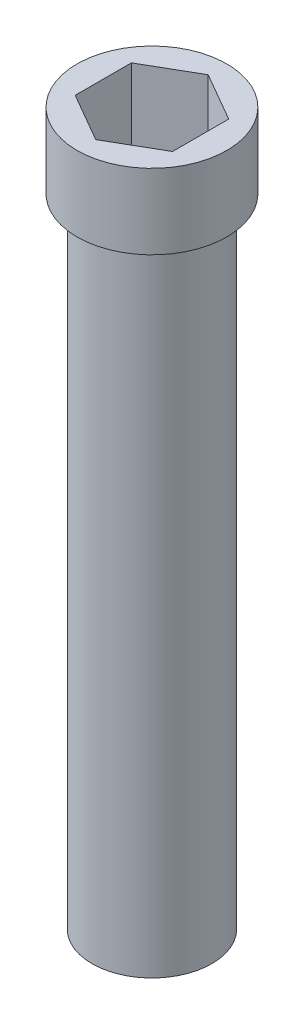
ISO-10303-21;
HEADER;
FILE_DESCRIPTION(('STEP AP214'),'2;1');
FILE_NAME('part.step','',(''),(''),'','','');
FILE_SCHEMA(('AUTOMOTIVE_DESIGN { 1 0 10303 214 1 1 1 1 }'));
ENDSEC;
DATA;
#1=APPLICATION_CONTEXT('core data for automotive mechanical design processes');
#2=APPLICATION_PROTOCOL_DEFINITION('international standard','automotive_design',2000,#1);
#3=PRODUCT_CONTEXT('',#1,'mechanical');
#4=PRODUCT('Part','Part','',(#3));
#5=PRODUCT_RELATED_PRODUCT_CATEGORY('part','',(#4));
#6=PRODUCT_DEFINITION_FORMATION('','',#4);
#7=PRODUCT_DEFINITION_CONTEXT('part definition',#1,'design');
#8=PRODUCT_DEFINITION('design','',#6,#7);
#9=PRODUCT_DEFINITION_SHAPE('','',#8);
#10=(LENGTH_UNIT() NAMED_UNIT(*) SI_UNIT(.MILLI.,.METRE.));
#11=(NAMED_UNIT(*) PLANE_ANGLE_UNIT() SI_UNIT($,.RADIAN.));
#12=(NAMED_UNIT(*) SI_UNIT($,.STERADIAN.) SOLID_ANGLE_UNIT());
#13=UNCERTAINTY_MEASURE_WITH_UNIT(LENGTH_MEASURE(1.E-05),#10,'distance_accuracy_value','');
#14=(GEOMETRIC_REPRESENTATION_CONTEXT(3) GLOBAL_UNCERTAINTY_ASSIGNED_CONTEXT((#13)) GLOBAL_UNIT_ASSIGNED_CONTEXT((#10,
#11,#12)) REPRESENTATION_CONTEXT('',''));
#15=CARTESIAN_POINT('',(0.,0.,0.));
#16=DIRECTION('',(0.,0.,1.));
#17=DIRECTION('',(1.,0.,0.));
#18=AXIS2_PLACEMENT_3D('',#15,#16,#17);
#19=CARTESIAN_POINT('',(0.,17.,0.));
#20=DIRECTION('',(0.,-1.,0.));
#21=DIRECTION('',(0.,0.,-1.));
#22=AXIS2_PLACEMENT_3D('',#19,#20,#21);
#23=CYLINDRICAL_SURFACE('',#22,1.6);
#24=CARTESIAN_POINT('',(0.,17.,0.));
#25=DIRECTION('',(0.,1.,0.));
#26=DIRECTION('',(0.,0.,1.));
#27=AXIS2_PLACEMENT_3D('',#24,#25,#26);
#28=CIRCLE('',#27,1.6);
#29=CARTESIAN_POINT('',(0.,17.,1.6));
#30=VERTEX_POINT('',#29);
#31=EDGE_CURVE('E11',#30,#30,#28,.T.);
#32=ORIENTED_EDGE('',*,*,#31,.F.);
#33=EDGE_LOOP('',(#32));
#34=FACE_BOUND('',#33,.T.);
#35=CARTESIAN_POINT('',(0.,0.,0.));
#36=DIRECTION('',(0.,1.,0.));
#37=DIRECTION('',(0.,0.,1.));
#38=AXIS2_PLACEMENT_3D('',#35,#36,#37);
#39=CIRCLE('',#38,1.6);
#40=CARTESIAN_POINT('',(0.,0.,1.6));
#41=VERTEX_POINT('',#40);
#42=EDGE_CURVE('E42',#41,#41,#39,.T.);
#43=ORIENTED_EDGE('',*,*,#42,.T.);
#44=EDGE_LOOP('',(#43));
#45=FACE_BOUND('',#44,.T.);
#46=ADVANCED_FACE('F39',(#34,#45),#23,.T.);
#47=CARTESIAN_POINT('',(0.,0.,0.));
#48=DIRECTION('',(0.,1.,0.));
#49=DIRECTION('',(0.,0.,1.));
#50=AXIS2_PLACEMENT_3D('',#47,#48,#49);
#51=PLANE('',#50);
#52=ORIENTED_EDGE('',*,*,#42,.F.);
#53=EDGE_LOOP('',(#52));
#54=FACE_BOUND('',#53,.T.);
#55=ADVANCED_FACE('F171',(#54),#51,.F.);
#56=CARTESIAN_POINT('',(0.,19.,0.));
#57=DIRECTION('',(0.,-1.,0.));
#58=DIRECTION('',(0.,0.,-1.));
#59=AXIS2_PLACEMENT_3D('',#56,#57,#58);
#60=CYLINDRICAL_SURFACE('',#59,2.);
#61=CARTESIAN_POINT('',(0.,19.,0.));
#62=DIRECTION('',(0.,1.,0.));
#63=DIRECTION('',(0.,0.,1.));
#64=AXIS2_PLACEMENT_3D('',#61,#62,#63);
#65=CIRCLE('',#64,2.);
#66=CARTESIAN_POINT('',(0.,19.,2.));
#67=VERTEX_POINT('',#66);
#68=EDGE_CURVE('E146',#67,#67,#65,.T.);
#69=ORIENTED_EDGE('',*,*,#68,.F.);
#70=EDGE_LOOP('',(#69));
#71=FACE_BOUND('',#70,.T.);
#72=CARTESIAN_POINT('',(0.,17.,0.));
#73=DIRECTION('',(0.,1.,0.));
#74=DIRECTION('',(0.,0.,1.));
#75=AXIS2_PLACEMENT_3D('',#72,#73,#74);
#76=CIRCLE('',#75,2.);
#77=CARTESIAN_POINT('',(0.,17.,2.));
#78=VERTEX_POINT('',#77);
#79=EDGE_CURVE('E140',#78,#78,#76,.T.);
#80=ORIENTED_EDGE('',*,*,#79,.T.);
#81=EDGE_LOOP('',(#80));
#82=FACE_BOUND('',#81,.T.);
#83=ADVANCED_FACE('F152',(#71,#82),#60,.T.);
#84=CARTESIAN_POINT('',(0.,19.,0.));
#85=DIRECTION('',(0.,1.,0.));
#86=DIRECTION('',(0.,0.,1.));
#87=AXIS2_PLACEMENT_3D('',#84,#85,#86);
#88=PLANE('',#87);
#89=DIRECTION('',(-0.866025403784439,0.,-0.5));
#90=VECTOR('',#89,1.);
#91=CARTESIAN_POINT('',(1.29903810567666,19.,-0.75));
#92=LINE('',#91,#90);
#93=CARTESIAN_POINT('',(1.29903810567666,19.,-0.75));
#94=VERTEX_POINT('',#93);
#95=CARTESIAN_POINT('',(0.,19.,-1.5));
#96=VERTEX_POINT('',#95);
#97=EDGE_CURVE('E53',#94,#96,#92,.T.);
#98=ORIENTED_EDGE('',*,*,#97,.F.);
#99=DIRECTION('',(0.,0.,-1.));
#100=VECTOR('',#99,1.);
#101=CARTESIAN_POINT('',(1.29903810567666,19.,0.75));
#102=LINE('',#101,#100);
#103=CARTESIAN_POINT('',(1.29903810567666,19.,0.75));
#104=VERTEX_POINT('',#103);
#105=EDGE_CURVE('E136',#104,#94,#102,.T.);
#106=ORIENTED_EDGE('',*,*,#105,.F.);
#107=DIRECTION('',(0.866025403784439,0.,-0.5));
#108=VECTOR('',#107,1.);
#109=CARTESIAN_POINT('',(0.,19.,1.5));
#110=LINE('',#109,#108);
#111=CARTESIAN_POINT('',(0.,19.,1.5));
#112=VERTEX_POINT('',#111);
#113=EDGE_CURVE('E134',#112,#104,#110,.T.);
#114=ORIENTED_EDGE('',*,*,#113,.F.);
#115=DIRECTION('',(0.866025403784439,0.,0.5));
#116=VECTOR('',#115,1.);
#117=CARTESIAN_POINT('',(-1.29903810567666,19.,0.749999999999999));
#118=LINE('',#117,#116);
#119=CARTESIAN_POINT('',(-1.29903810567666,19.,0.749999999999999));
#120=VERTEX_POINT('',#119);
#121=EDGE_CURVE('E101',#120,#112,#118,.T.);
#122=ORIENTED_EDGE('',*,*,#121,.F.);
#123=DIRECTION('',(0.,0.,1.));
#124=VECTOR('',#123,1.);
#125=CARTESIAN_POINT('',(-1.29903810567666,19.,-0.75));
#126=LINE('',#125,#124);
#127=CARTESIAN_POINT('',(-1.29903810567666,19.,-0.75));
#128=VERTEX_POINT('',#127);
#129=EDGE_CURVE('E130',#128,#120,#126,.T.);
#130=ORIENTED_EDGE('',*,*,#129,.F.);
#131=DIRECTION('',(-0.866025403784439,0.,0.5));
#132=VECTOR('',#131,1.);
#133=CARTESIAN_POINT('',(0.,19.,-1.5));
#134=LINE('',#133,#132);
#135=EDGE_CURVE('E127',#96,#128,#134,.T.);
#136=ORIENTED_EDGE('',*,*,#135,.F.);
#137=EDGE_LOOP('',(#98,#106,#114,#122,#130,#136));
#138=FACE_BOUND('',#137,.T.);
#139=ORIENTED_EDGE('',*,*,#68,.T.);
#140=EDGE_LOOP('',(#139));
#141=FACE_BOUND('',#140,.T.);
#142=ADVANCED_FACE('F157',(#138,#141),#88,.T.);
#143=CARTESIAN_POINT('',(0.,17.,0.));
#144=DIRECTION('',(0.,1.,0.));
#145=DIRECTION('',(0.,0.,1.));
#146=AXIS2_PLACEMENT_3D('',#143,#144,#145);
#147=PLANE('',#146);
#148=ORIENTED_EDGE('',*,*,#31,.T.);
#149=EDGE_LOOP('',(#148));
#150=FACE_BOUND('',#149,.T.);
#151=ORIENTED_EDGE('',*,*,#79,.F.);
#152=EDGE_LOOP('',(#151));
#153=FACE_BOUND('',#152,.T.);
#154=ADVANCED_FACE('F154',(#150,#153),#147,.F.);
#155=CARTESIAN_POINT('',(1.29903810567666,17.,-0.75));
#156=DIRECTION('',(0.5,0.,-0.866025403784439));
#157=DIRECTION('',(-0.866025403784439,0.,-0.5));
#158=AXIS2_PLACEMENT_3D('',#155,#156,#157);
#159=PLANE('',#158);
#160=ORIENTED_EDGE('',*,*,#97,.T.);
#161=DIRECTION('',(0.,1.,0.));
#162=VECTOR('',#161,1.);
#163=CARTESIAN_POINT('',(0.,17.,-1.5));
#164=LINE('',#163,#162);
#165=CARTESIAN_POINT('',(0.,17.,-1.5));
#166=VERTEX_POINT('',#165);
#167=EDGE_CURVE('E83',#166,#96,#164,.T.);
#168=ORIENTED_EDGE('',*,*,#167,.F.);
#169=DIRECTION('',(-0.866025403784439,0.,-0.5));
#170=VECTOR('',#169,1.);
#171=CARTESIAN_POINT('',(1.29903810567666,17.,-0.75));
#172=LINE('',#171,#170);
#173=CARTESIAN_POINT('',(1.29903810567666,17.,-0.75));
#174=VERTEX_POINT('',#173);
#175=EDGE_CURVE('E138',#174,#166,#172,.T.);
#176=ORIENTED_EDGE('',*,*,#175,.F.);
#177=DIRECTION('',(0.,1.,0.));
#178=VECTOR('',#177,1.);
#179=CARTESIAN_POINT('',(1.29903810567666,17.,-0.75));
#180=LINE('',#179,#178);
#181=EDGE_CURVE('E61',#174,#94,#180,.T.);
#182=ORIENTED_EDGE('',*,*,#181,.T.);
#183=EDGE_LOOP('',(#160,#168,#176,#182));
#184=FACE_BOUND('',#183,.T.);
#185=ADVANCED_FACE('F156',(#184),#159,.F.);
#186=CARTESIAN_POINT('',(1.29903810567666,17.,0.75));
#187=DIRECTION('',(1.,0.,0.));
#188=DIRECTION('',(0.,0.,-1.));
#189=AXIS2_PLACEMENT_3D('',#186,#187,#188);
#190=PLANE('',#189);
#191=ORIENTED_EDGE('',*,*,#105,.T.);
#192=ORIENTED_EDGE('',*,*,#181,.F.);
#193=DIRECTION('',(0.,0.,-1.));
#194=VECTOR('',#193,1.);
#195=CARTESIAN_POINT('',(1.29903810567666,17.,0.75));
#196=LINE('',#195,#194);
#197=CARTESIAN_POINT('',(1.29903810567666,17.,0.75));
#198=VERTEX_POINT('',#197);
#199=EDGE_CURVE('E113',#198,#174,#196,.T.);
#200=ORIENTED_EDGE('',*,*,#199,.F.);
#201=DIRECTION('',(0.,1.,0.));
#202=VECTOR('',#201,1.);
#203=CARTESIAN_POINT('',(1.29903810567666,17.,0.75));
#204=LINE('',#203,#202);
#205=EDGE_CURVE('E105',#198,#104,#204,.T.);
#206=ORIENTED_EDGE('',*,*,#205,.T.);
#207=EDGE_LOOP('',(#191,#192,#200,#206));
#208=FACE_BOUND('',#207,.T.);
#209=ADVANCED_FACE('F165',(#208),#190,.F.);
#210=CARTESIAN_POINT('',(0.,17.,1.5));
#211=DIRECTION('',(0.5,0.,0.866025403784439));
#212=DIRECTION('',(0.866025403784439,0.,-0.5));
#213=AXIS2_PLACEMENT_3D('',#210,#211,#212);
#214=PLANE('',#213);
#215=ORIENTED_EDGE('',*,*,#113,.T.);
#216=ORIENTED_EDGE('',*,*,#205,.F.);
#217=DIRECTION('',(0.866025403784439,0.,-0.5));
#218=VECTOR('',#217,1.);
#219=CARTESIAN_POINT('',(0.,17.,1.5));
#220=LINE('',#219,#218);
#221=CARTESIAN_POINT('',(0.,17.,1.5));
#222=VERTEX_POINT('',#221);
#223=EDGE_CURVE('E109',#222,#198,#220,.T.);
#224=ORIENTED_EDGE('',*,*,#223,.F.);
#225=DIRECTION('',(0.,1.,0.));
#226=VECTOR('',#225,1.);
#227=CARTESIAN_POINT('',(0.,17.,1.5));
#228=LINE('',#227,#226);
#229=EDGE_CURVE('E94',#222,#112,#228,.T.);
#230=ORIENTED_EDGE('',*,*,#229,.T.);
#231=EDGE_LOOP('',(#215,#216,#224,#230));
#232=FACE_BOUND('',#231,.T.);
#233=ADVANCED_FACE('F110',(#232),#214,.F.);
#234=CARTESIAN_POINT('',(-1.29903810567666,17.,0.749999999999999));
#235=DIRECTION('',(-0.5,0.,0.866025403784439));
#236=DIRECTION('',(0.866025403784439,0.,0.5));
#237=AXIS2_PLACEMENT_3D('',#234,#235,#236);
#238=PLANE('',#237);
#239=ORIENTED_EDGE('',*,*,#121,.T.);
#240=ORIENTED_EDGE('',*,*,#229,.F.);
#241=DIRECTION('',(0.866025403784439,0.,0.5));
#242=VECTOR('',#241,1.);
#243=CARTESIAN_POINT('',(-1.29903810567666,17.,0.749999999999999));
#244=LINE('',#243,#242);
#245=CARTESIAN_POINT('',(-1.29903810567666,17.,0.749999999999999));
#246=VERTEX_POINT('',#245);
#247=EDGE_CURVE('E98',#246,#222,#244,.T.);
#248=ORIENTED_EDGE('',*,*,#247,.F.);
#249=DIRECTION('',(0.,1.,0.));
#250=VECTOR('',#249,1.);
#251=CARTESIAN_POINT('',(-1.29903810567666,17.,0.749999999999999));
#252=LINE('',#251,#250);
#253=EDGE_CURVE('E106',#246,#120,#252,.T.);
#254=ORIENTED_EDGE('',*,*,#253,.T.);
#255=EDGE_LOOP('',(#239,#240,#248,#254));
#256=FACE_BOUND('',#255,.T.);
#257=ADVANCED_FACE('F96',(#256),#238,.F.);
#258=CARTESIAN_POINT('',(-1.29903810567666,17.,-0.75));
#259=DIRECTION('',(-1.,0.,0.));
#260=DIRECTION('',(0.,0.,1.));
#261=AXIS2_PLACEMENT_3D('',#258,#259,#260);
#262=PLANE('',#261);
#263=ORIENTED_EDGE('',*,*,#129,.T.);
#264=ORIENTED_EDGE('',*,*,#253,.F.);
#265=DIRECTION('',(0.,0.,1.));
#266=VECTOR('',#265,1.);
#267=CARTESIAN_POINT('',(-1.29903810567666,17.,-0.75));
#268=LINE('',#267,#266);
#269=CARTESIAN_POINT('',(-1.29903810567666,17.,-0.75));
#270=VERTEX_POINT('',#269);
#271=EDGE_CURVE('E119',#270,#246,#268,.T.);
#272=ORIENTED_EDGE('',*,*,#271,.F.);
#273=DIRECTION('',(0.,1.,0.));
#274=VECTOR('',#273,1.);
#275=CARTESIAN_POINT('',(-1.29903810567666,17.,-0.75));
#276=LINE('',#275,#274);
#277=EDGE_CURVE('E143',#270,#128,#276,.T.);
#278=ORIENTED_EDGE('',*,*,#277,.T.);
#279=EDGE_LOOP('',(#263,#264,#272,#278));
#280=FACE_BOUND('',#279,.T.);
#281=ADVANCED_FACE('F233',(#280),#262,.F.);
#282=CARTESIAN_POINT('',(0.,17.,-1.5));
#283=DIRECTION('',(-0.5,0.,-0.866025403784439));
#284=DIRECTION('',(-0.866025403784439,0.,0.5));
#285=AXIS2_PLACEMENT_3D('',#282,#283,#284);
#286=PLANE('',#285);
#287=ORIENTED_EDGE('',*,*,#135,.T.);
#288=ORIENTED_EDGE('',*,*,#277,.F.);
#289=DIRECTION('',(-0.866025403784439,0.,0.5));
#290=VECTOR('',#289,1.);
#291=CARTESIAN_POINT('',(0.,17.,-1.5));
#292=LINE('',#291,#290);
#293=EDGE_CURVE('E121',#166,#270,#292,.T.);
#294=ORIENTED_EDGE('',*,*,#293,.F.);
#295=ORIENTED_EDGE('',*,*,#167,.T.);
#296=EDGE_LOOP('',(#287,#288,#294,#295));
#297=FACE_BOUND('',#296,.T.);
#298=ADVANCED_FACE('F242',(#297),#286,.F.);
#299=CARTESIAN_POINT('',(0.,17.,0.));
#300=DIRECTION('',(0.,1.,0.));
#301=DIRECTION('',(0.,0.,1.));
#302=AXIS2_PLACEMENT_3D('',#299,#300,#301);
#303=PLANE('',#302);
#304=ORIENTED_EDGE('',*,*,#175,.T.);
#305=ORIENTED_EDGE('',*,*,#293,.T.);
#306=ORIENTED_EDGE('',*,*,#271,.T.);
#307=ORIENTED_EDGE('',*,*,#247,.T.);
#308=ORIENTED_EDGE('',*,*,#223,.T.);
#309=ORIENTED_EDGE('',*,*,#199,.T.);
#310=EDGE_LOOP('',(#304,#305,#306,#307,#308,#309));
#311=FACE_BOUND('',#310,.T.);
#312=ADVANCED_FACE('F116',(#311),#303,.T.);
#313=CLOSED_SHELL('',(#46,#55,#83,#142,#154,#185,#209,#233,#257,#281,#298,#312));
#314=MANIFOLD_SOLID_BREP('B2',#313);
#315=ADVANCED_BREP_SHAPE_REPRESENTATION('',(#18,#314),#14);
#316=SHAPE_DEFINITION_REPRESENTATION(#9,#315);
ENDSEC;
END-ISO-10303-21;
